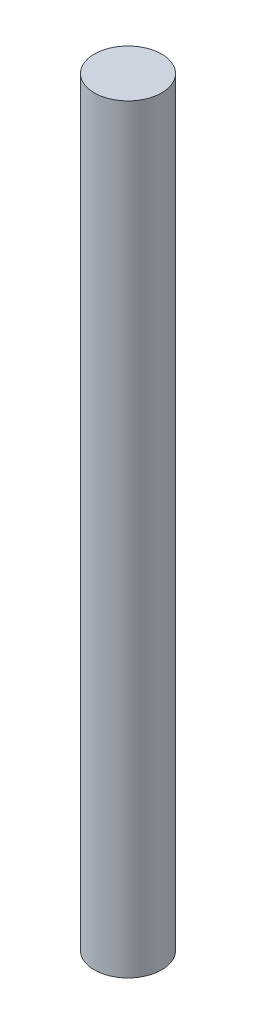
ISO-10303-21;
HEADER;
FILE_DESCRIPTION(('STEP AP214'),'2;1');
FILE_NAME('part.step','',(''),(''),'','','');
FILE_SCHEMA(('AUTOMOTIVE_DESIGN { 1 0 10303 214 1 1 1 1 }'));
ENDSEC;
DATA;
#1=APPLICATION_CONTEXT('core data for automotive mechanical design processes');
#2=APPLICATION_PROTOCOL_DEFINITION('international standard','automotive_design',2000,#1);
#3=PRODUCT_CONTEXT('',#1,'mechanical');
#4=PRODUCT('Part','Part','',(#3));
#5=PRODUCT_RELATED_PRODUCT_CATEGORY('part','',(#4));
#6=PRODUCT_DEFINITION_FORMATION('','',#4);
#7=PRODUCT_DEFINITION_CONTEXT('part definition',#1,'design');
#8=PRODUCT_DEFINITION('design','',#6,#7);
#9=PRODUCT_DEFINITION_SHAPE('','',#8);
#10=(LENGTH_UNIT() NAMED_UNIT(*) SI_UNIT(.MILLI.,.METRE.));
#11=(NAMED_UNIT(*) PLANE_ANGLE_UNIT() SI_UNIT($,.RADIAN.));
#12=(NAMED_UNIT(*) SI_UNIT($,.STERADIAN.) SOLID_ANGLE_UNIT());
#13=UNCERTAINTY_MEASURE_WITH_UNIT(LENGTH_MEASURE(1.E-05),#10,'distance_accuracy_value','');
#14=(GEOMETRIC_REPRESENTATION_CONTEXT(3) GLOBAL_UNCERTAINTY_ASSIGNED_CONTEXT((#13)) GLOBAL_UNIT_ASSIGNED_CONTEXT((#10,
#11,#12)) REPRESENTATION_CONTEXT('',''));
#15=CARTESIAN_POINT('',(0.,0.,0.));
#16=DIRECTION('',(0.,0.,1.));
#17=DIRECTION('',(1.,0.,0.));
#18=AXIS2_PLACEMENT_3D('',#15,#16,#17);
#19=CARTESIAN_POINT('',(225.,-0.00100000000013978,-225.));
#20=DIRECTION('',(0.,1.,0.));
#21=DIRECTION('',(-1.,0.,0.));
#22=AXIS2_PLACEMENT_3D('',#19,#20,#21);
#23=CYLINDRICAL_SURFACE('',#22,17.5);
#24=CARTESIAN_POINT('',(225.,470.,-225.));
#25=DIRECTION('',(0.,1.,0.));
#26=DIRECTION('',(-1.,0.,0.));
#27=AXIS2_PLACEMENT_3D('',#24,#25,#26);
#28=CIRCLE('',#27,17.5);
#29=CARTESIAN_POINT('',(207.5,470.,-225.));
#30=VERTEX_POINT('',#29);
#31=EDGE_CURVE('E150',#30,#30,#28,.T.);
#32=ORIENTED_EDGE('',*,*,#31,.F.);
#33=EDGE_LOOP('',(#32));
#34=FACE_BOUND('',#33,.T.);
#35=CARTESIAN_POINT('',(225.,75.,-225.));
#36=DIRECTION('',(0.,1.,0.));
#37=DIRECTION('',(-1.,0.,0.));
#38=AXIS2_PLACEMENT_3D('',#35,#36,#37);
#39=CIRCLE('',#38,17.5);
#40=CARTESIAN_POINT('',(207.5,75.,-225.));
#41=VERTEX_POINT('',#40);
#42=EDGE_CURVE('E149',#41,#41,#39,.F.);
#43=ORIENTED_EDGE('',*,*,#42,.F.);
#44=EDGE_LOOP('',(#43));
#45=FACE_BOUND('',#44,.T.);
#46=CARTESIAN_POINT('',(225.,338.430074331173,-225.));
#47=DIRECTION('',(0.,1.,0.));
#48=DIRECTION('',(0.,0.,1.));
#49=AXIS2_PLACEMENT_3D('',#46,#47,#48);
#50=CIRCLE('',#49,17.5);
#51=CARTESIAN_POINT('',(207.645245608191,338.430074331173,-222.75));
#52=VERTEX_POINT('',#51);
#53=CARTESIAN_POINT('',(207.645245608191,338.430074331173,-227.25));
#54=VERTEX_POINT('',#53);
#55=EDGE_CURVE('E153',#52,#54,#50,.F.);
#56=ORIENTED_EDGE('',*,*,#55,.T.);
#57=DIRECTION('',(0.,1.,0.));
#58=VECTOR('',#57,1.);
#59=CARTESIAN_POINT('',(207.645245608191,-0.00100000000013978,-227.250000000001));
#60=LINE('',#59,#58);
#61=CARTESIAN_POINT('',(207.645245608191,388.430074331173,-227.25));
#62=VERTEX_POINT('',#61);
#63=EDGE_CURVE('E11',#54,#62,#60,.T.);
#64=ORIENTED_EDGE('',*,*,#63,.T.);
#65=CARTESIAN_POINT('',(225.,388.430074331173,-225.));
#66=DIRECTION('',(0.,-1.,0.));
#67=DIRECTION('',(0.,0.,-1.));
#68=AXIS2_PLACEMENT_3D('',#65,#66,#67);
#69=CIRCLE('',#68,17.5);
#70=CARTESIAN_POINT('',(207.645245608191,388.430074331173,-222.75));
#71=VERTEX_POINT('',#70);
#72=EDGE_CURVE('E47',#62,#71,#69,.F.);
#73=ORIENTED_EDGE('',*,*,#72,.T.);
#74=DIRECTION('',(0.,1.,0.));
#75=VECTOR('',#74,1.);
#76=CARTESIAN_POINT('',(207.645245608191,-0.00100000000013978,-222.750000000001));
#77=LINE('',#76,#75);
#78=EDGE_CURVE('E158',#71,#52,#77,.F.);
#79=ORIENTED_EDGE('',*,*,#78,.T.);
#80=EDGE_LOOP('',(#56,#64,#73,#79));
#81=FACE_BOUND('',#80,.T.);
#82=ADVANCED_FACE('F39',(#34,#45,#81),#23,.T.);
#83=CARTESIAN_POINT('',(225.,470.,-225.));
#84=DIRECTION('',(0.,1.,0.));
#85=DIRECTION('',(-1.,0.,0.));
#86=AXIS2_PLACEMENT_3D('',#83,#84,#85);
#87=PLANE('',#86);
#88=ORIENTED_EDGE('',*,*,#31,.T.);
#89=EDGE_LOOP('',(#88));
#90=FACE_BOUND('',#89,.T.);
#91=ADVANCED_FACE('F183',(#90),#87,.T.);
#92=CARTESIAN_POINT('',(225.,75.,-225.));
#93=DIRECTION('',(0.,1.,0.));
#94=DIRECTION('',(-1.,0.,0.));
#95=AXIS2_PLACEMENT_3D('',#92,#93,#94);
#96=PLANE('',#95);
#97=ORIENTED_EDGE('',*,*,#42,.T.);
#98=EDGE_LOOP('',(#97));
#99=FACE_BOUND('',#98,.T.);
#100=ADVANCED_FACE('F41',(#99),#96,.F.);
#101=CARTESIAN_POINT('',(214.845153424315,388.430074331173,-227.25));
#102=DIRECTION('',(0.,0.,1.));
#103=DIRECTION('',(0.,-1.,0.));
#104=AXIS2_PLACEMENT_3D('',#101,#102,#103);
#105=PLANE('',#104);
#106=ORIENTED_EDGE('',*,*,#63,.F.);
#107=DIRECTION('',(-1.,0.,0.));
#108=VECTOR('',#107,1.);
#109=CARTESIAN_POINT('',(214.845153424315,338.430074331173,-227.25));
#110=LINE('',#109,#108);
#111=CARTESIAN_POINT('',(204.845153424315,338.430074331173,-227.25));
#112=VERTEX_POINT('',#111);
#113=EDGE_CURVE('E54',#54,#112,#110,.T.);
#114=ORIENTED_EDGE('',*,*,#113,.T.);
#115=DIRECTION('',(0.,1.,0.));
#116=VECTOR('',#115,1.);
#117=CARTESIAN_POINT('',(204.845153424315,388.430074331173,-227.25));
#118=LINE('',#117,#116);
#119=CARTESIAN_POINT('',(204.845153424315,388.430074331173,-227.25));
#120=VERTEX_POINT('',#119);
#121=EDGE_CURVE('E131',#112,#120,#118,.T.);
#122=ORIENTED_EDGE('',*,*,#121,.T.);
#123=DIRECTION('',(-1.,0.,0.));
#124=VECTOR('',#123,1.);
#125=CARTESIAN_POINT('',(214.845153424315,388.430074331173,-227.25));
#126=LINE('',#125,#124);
#127=EDGE_CURVE('E147',#62,#120,#126,.T.);
#128=ORIENTED_EDGE('',*,*,#127,.F.);
#129=EDGE_LOOP('',(#106,#114,#122,#128));
#130=FACE_BOUND('',#129,.T.);
#131=ADVANCED_FACE('F162',(#130),#105,.F.);
#132=CARTESIAN_POINT('',(214.845153424315,388.430074331173,-222.75));
#133=DIRECTION('',(0.,-1.,0.));
#134=DIRECTION('',(0.,0.,-1.));
#135=AXIS2_PLACEMENT_3D('',#132,#133,#134);
#136=PLANE('',#135);
#137=ORIENTED_EDGE('',*,*,#72,.F.);
#138=ORIENTED_EDGE('',*,*,#127,.T.);
#139=DIRECTION('',(0.,0.,1.));
#140=VECTOR('',#139,1.);
#141=CARTESIAN_POINT('',(204.845153424315,388.430074331173,-222.75));
#142=LINE('',#141,#140);
#143=CARTESIAN_POINT('',(204.845153424315,388.430074331173,-222.75));
#144=VERTEX_POINT('',#143);
#145=EDGE_CURVE('E134',#120,#144,#142,.T.);
#146=ORIENTED_EDGE('',*,*,#145,.T.);
#147=DIRECTION('',(-1.,0.,0.));
#148=VECTOR('',#147,1.);
#149=CARTESIAN_POINT('',(214.845153424315,388.430074331173,-222.75));
#150=LINE('',#149,#148);
#151=EDGE_CURVE('E145',#71,#144,#150,.T.);
#152=ORIENTED_EDGE('',*,*,#151,.F.);
#153=EDGE_LOOP('',(#137,#138,#146,#152));
#154=FACE_BOUND('',#153,.T.);
#155=ADVANCED_FACE('F165',(#154),#136,.F.);
#156=CARTESIAN_POINT('',(214.845153424315,388.430074331173,-222.75));
#157=DIRECTION('',(0.,0.,-1.));
#158=DIRECTION('',(0.,1.,0.));
#159=AXIS2_PLACEMENT_3D('',#156,#157,#158);
#160=PLANE('',#159);
#161=ORIENTED_EDGE('',*,*,#78,.F.);
#162=ORIENTED_EDGE('',*,*,#151,.T.);
#163=DIRECTION('',(0.,-1.,0.));
#164=VECTOR('',#163,1.);
#165=CARTESIAN_POINT('',(204.845153424315,388.430074331173,-222.75));
#166=LINE('',#165,#164);
#167=CARTESIAN_POINT('',(204.845153424315,338.430074331173,-222.75));
#168=VERTEX_POINT('',#167);
#169=EDGE_CURVE('E137',#144,#168,#166,.T.);
#170=ORIENTED_EDGE('',*,*,#169,.T.);
#171=DIRECTION('',(-1.,0.,0.));
#172=VECTOR('',#171,1.);
#173=CARTESIAN_POINT('',(214.845153424315,338.430074331173,-222.75));
#174=LINE('',#173,#172);
#175=EDGE_CURVE('E143',#52,#168,#174,.T.);
#176=ORIENTED_EDGE('',*,*,#175,.F.);
#177=EDGE_LOOP('',(#161,#162,#170,#176));
#178=FACE_BOUND('',#177,.T.);
#179=ADVANCED_FACE('F172',(#178),#160,.F.);
#180=CARTESIAN_POINT('',(214.845153424315,338.430074331173,-222.75));
#181=DIRECTION('',(0.,1.,0.));
#182=DIRECTION('',(0.,0.,1.));
#183=AXIS2_PLACEMENT_3D('',#180,#181,#182);
#184=PLANE('',#183);
#185=ORIENTED_EDGE('',*,*,#55,.F.);
#186=ORIENTED_EDGE('',*,*,#175,.T.);
#187=DIRECTION('',(0.,0.,-1.));
#188=VECTOR('',#187,1.);
#189=CARTESIAN_POINT('',(204.845153424315,338.430074331173,-222.75));
#190=LINE('',#189,#188);
#191=EDGE_CURVE('E140',#168,#112,#190,.T.);
#192=ORIENTED_EDGE('',*,*,#191,.T.);
#193=ORIENTED_EDGE('',*,*,#113,.F.);
#194=EDGE_LOOP('',(#185,#186,#192,#193));
#195=FACE_BOUND('',#194,.T.);
#196=ADVANCED_FACE('F173',(#195),#184,.F.);
#197=CARTESIAN_POINT('',(204.845153424315,0.,0.));
#198=DIRECTION('',(1.,0.,0.));
#199=DIRECTION('',(0.,0.,-1.));
#200=AXIS2_PLACEMENT_3D('',#197,#198,#199);
#201=PLANE('',#200);
#202=ORIENTED_EDGE('',*,*,#121,.F.);
#203=ORIENTED_EDGE('',*,*,#191,.F.);
#204=ORIENTED_EDGE('',*,*,#169,.F.);
#205=ORIENTED_EDGE('',*,*,#145,.F.);
#206=EDGE_LOOP('',(#202,#203,#204,#205));
#207=FACE_BOUND('',#206,.T.);
#208=ADVANCED_FACE('F168',(#207),#201,.F.);
#209=CLOSED_SHELL('',(#82,#91,#100,#131,#155,#179,#196,#208));
#210=CARTESIAN_POINT('',(216.843728175888,335.4396373594,-245.74987186631));
#211=DIRECTION('',(1.,0.,0.));
#212=DIRECTION('',(0.,0.,-1.));
#213=AXIS2_PLACEMENT_3D('',#210,#211,#212);
#214=PLANE('',#213);
#215=DIRECTION('',(0.,-1.,0.));
#216=VECTOR('',#215,1.);
#217=CARTESIAN_POINT('',(216.843728175888,335.4396373594,-227.25));
#218=LINE('',#217,#216);
#219=CARTESIAN_POINT('',(216.843728175888,352.814979802081,-227.25));
#220=VERTEX_POINT('',#219);
#221=CARTESIAN_POINT('',(216.843728175888,335.4396373594,-227.25));
#222=VERTEX_POINT('',#221);
#223=EDGE_CURVE('E123',#220,#222,#218,.T.);
#224=ORIENTED_EDGE('',*,*,#223,.T.);
#225=DIRECTION('',(0.,0.,1.));
#226=VECTOR('',#225,1.);
#227=CARTESIAN_POINT('',(216.843728175888,335.4396373594,-245.74987186631));
#228=LINE('',#227,#226);
#229=CARTESIAN_POINT('',(216.843728175888,335.4396373594,-222.750000000001));
#230=VERTEX_POINT('',#229);
#231=EDGE_CURVE('E120',#222,#230,#228,.T.);
#232=ORIENTED_EDGE('',*,*,#231,.T.);
#233=DIRECTION('',(0.,1.,0.));
#234=VECTOR('',#233,1.);
#235=CARTESIAN_POINT('',(216.843728175888,335.4396373594,-222.750000000001));
#236=LINE('',#235,#234);
#237=CARTESIAN_POINT('',(216.843728175888,352.814979802081,-222.750000000001));
#238=VERTEX_POINT('',#237);
#239=EDGE_CURVE('E115',#230,#238,#236,.T.);
#240=ORIENTED_EDGE('',*,*,#239,.T.);
#241=DIRECTION('',(0.,0.,1.));
#242=VECTOR('',#241,1.);
#243=CARTESIAN_POINT('',(216.843728175888,352.814979802081,-245.74987186631));
#244=LINE('',#243,#242);
#245=EDGE_CURVE('E98',#220,#238,#244,.T.);
#246=ORIENTED_EDGE('',*,*,#245,.F.);
#247=EDGE_LOOP('',(#224,#232,#240,#246));
#248=FACE_BOUND('',#247,.T.);
#249=ADVANCED_FACE('F118',(#248),#214,.F.);
#250=CARTESIAN_POINT('',(210.492135141895,335.4396373594,-245.74987186631));
#251=DIRECTION('',(0.,-1.,0.));
#252=DIRECTION('',(0.,0.,-1.));
#253=AXIS2_PLACEMENT_3D('',#250,#251,#252);
#254=PLANE('',#253);
#255=DIRECTION('',(-1.,0.,0.));
#256=VECTOR('',#255,1.);
#257=CARTESIAN_POINT('',(210.492135141895,335.4396373594,-227.25));
#258=LINE('',#257,#256);
#259=CARTESIAN_POINT('',(210.492135141895,335.4396373594,-227.25));
#260=VERTEX_POINT('',#259);
#261=EDGE_CURVE('E128',#222,#260,#258,.T.);
#262=ORIENTED_EDGE('',*,*,#261,.T.);
#263=DIRECTION('',(0.,0.,1.));
#264=VECTOR('',#263,1.);
#265=CARTESIAN_POINT('',(210.492135141895,335.4396373594,-245.74987186631));
#266=LINE('',#265,#264);
#267=CARTESIAN_POINT('',(210.492135141895,335.4396373594,-222.750000000001));
#268=VERTEX_POINT('',#267);
#269=EDGE_CURVE('E109',#260,#268,#266,.T.);
#270=ORIENTED_EDGE('',*,*,#269,.T.);
#271=DIRECTION('',(1.,0.,0.));
#272=VECTOR('',#271,1.);
#273=CARTESIAN_POINT('',(210.492135141895,335.4396373594,-222.750000000001));
#274=LINE('',#273,#272);
#275=EDGE_CURVE('E110',#268,#230,#274,.T.);
#276=ORIENTED_EDGE('',*,*,#275,.T.);
#277=ORIENTED_EDGE('',*,*,#231,.F.);
#278=EDGE_LOOP('',(#262,#270,#276,#277));
#279=FACE_BOUND('',#278,.T.);
#280=ADVANCED_FACE('F234',(#279),#254,.F.);
#281=CARTESIAN_POINT('',(216.843728175888,352.814979802081,-245.74987186631));
#282=DIRECTION('',(-0.939214204738502,0.343331731154322,0.));
#283=DIRECTION('',(-0.343331731154322,-0.939214204738502,0.));
#284=AXIS2_PLACEMENT_3D('',#281,#282,#283);
#285=PLANE('',#284);
#286=DIRECTION('',(0.343331731154322,0.939214204738502,0.));
#287=VECTOR('',#286,1.);
#288=CARTESIAN_POINT('',(216.843728175888,352.814979802081,-227.25));
#289=LINE('',#288,#287);
#290=EDGE_CURVE('E105',#260,#220,#289,.T.);
#291=ORIENTED_EDGE('',*,*,#290,.T.);
#292=ORIENTED_EDGE('',*,*,#245,.T.);
#293=DIRECTION('',(-0.343331731154322,-0.939214204738502,0.));
#294=VECTOR('',#293,1.);
#295=CARTESIAN_POINT('',(216.843728175888,352.814979802081,-222.750000000001));
#296=LINE('',#295,#294);
#297=EDGE_CURVE('E102',#238,#268,#296,.T.);
#298=ORIENTED_EDGE('',*,*,#297,.T.);
#299=ORIENTED_EDGE('',*,*,#269,.F.);
#300=EDGE_LOOP('',(#291,#292,#298,#299));
#301=FACE_BOUND('',#300,.T.);
#302=ADVANCED_FACE('F100',(#301),#285,.F.);
#303=CARTESIAN_POINT('',(0.,0.,-222.750000000001));
#304=DIRECTION('',(0.,0.,-1.));
#305=DIRECTION('',(-1.,0.,0.));
#306=AXIS2_PLACEMENT_3D('',#303,#304,#305);
#307=PLANE('',#306);
#308=ORIENTED_EDGE('',*,*,#239,.F.);
#309=ORIENTED_EDGE('',*,*,#275,.F.);
#310=ORIENTED_EDGE('',*,*,#297,.F.);
#311=EDGE_LOOP('',(#308,#309,#310));
#312=FACE_BOUND('',#311,.T.);
#313=ADVANCED_FACE('F114',(#312),#307,.T.);
#314=CARTESIAN_POINT('',(214.845153424315,388.430074331173,-227.25));
#315=DIRECTION('',(0.,0.,1.));
#316=DIRECTION('',(0.,-1.,0.));
#317=AXIS2_PLACEMENT_3D('',#314,#315,#316);
#318=PLANE('',#317);
#319=ORIENTED_EDGE('',*,*,#223,.F.);
#320=ORIENTED_EDGE('',*,*,#290,.F.);
#321=ORIENTED_EDGE('',*,*,#261,.F.);
#322=EDGE_LOOP('',(#319,#320,#321));
#323=FACE_BOUND('',#322,.T.);
#324=ADVANCED_FACE('F264',(#323),#318,.T.);
#325=CLOSED_SHELL('',(#249,#280,#302,#313,#324));
#326=ORIENTED_CLOSED_SHELL('',*,#325,.T.);
#327=BREP_WITH_VOIDS('B2',#209,(#326));
#328=ADVANCED_BREP_SHAPE_REPRESENTATION('',(#18,#327),#14);
#329=SHAPE_DEFINITION_REPRESENTATION(#9,#328);
ENDSEC;
END-ISO-10303-21;
